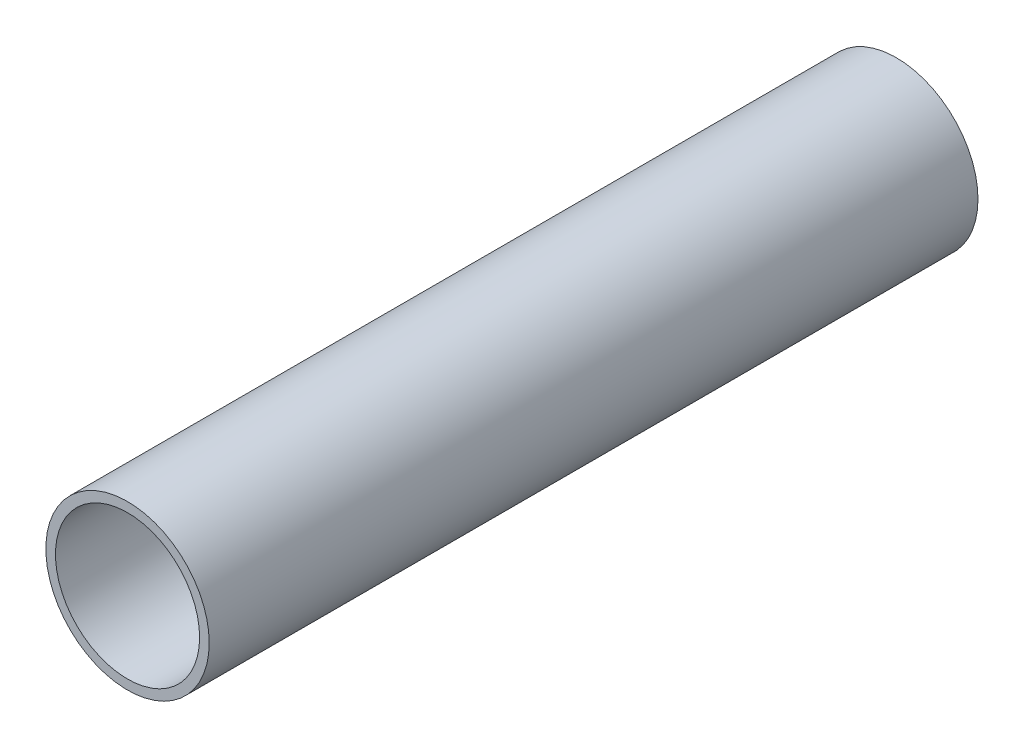
ISO-10303-21;
HEADER;
FILE_DESCRIPTION(('STEP AP214'),'2;1');
FILE_NAME('part.step','',(''),(''),'','','');
FILE_SCHEMA(('AUTOMOTIVE_DESIGN { 1 0 10303 214 1 1 1 1 }'));
ENDSEC;
DATA;
#1=APPLICATION_CONTEXT('core data for automotive mechanical design processes');
#2=APPLICATION_PROTOCOL_DEFINITION('international standard','automotive_design',2000,#1);
#3=PRODUCT_CONTEXT('',#1,'mechanical');
#4=PRODUCT('Part','Part','',(#3));
#5=PRODUCT_RELATED_PRODUCT_CATEGORY('part','',(#4));
#6=PRODUCT_DEFINITION_FORMATION('','',#4);
#7=PRODUCT_DEFINITION_CONTEXT('part definition',#1,'design');
#8=PRODUCT_DEFINITION('design','',#6,#7);
#9=PRODUCT_DEFINITION_SHAPE('','',#8);
#10=(LENGTH_UNIT() NAMED_UNIT(*) SI_UNIT(.MILLI.,.METRE.));
#11=(NAMED_UNIT(*) PLANE_ANGLE_UNIT() SI_UNIT($,.RADIAN.));
#12=(NAMED_UNIT(*) SI_UNIT($,.STERADIAN.) SOLID_ANGLE_UNIT());
#13=UNCERTAINTY_MEASURE_WITH_UNIT(LENGTH_MEASURE(1.E-05),#10,'distance_accuracy_value','');
#14=(GEOMETRIC_REPRESENTATION_CONTEXT(3) GLOBAL_UNCERTAINTY_ASSIGNED_CONTEXT((#13)) GLOBAL_UNIT_ASSIGNED_CONTEXT((#10,
#11,#12)) REPRESENTATION_CONTEXT('',''));
#15=CARTESIAN_POINT('',(0.,0.,0.));
#16=DIRECTION('',(0.,0.,1.));
#17=DIRECTION('',(1.,0.,0.));
#18=AXIS2_PLACEMENT_3D('',#15,#16,#17);
#19=CARTESIAN_POINT('',(0.,0.,80.));
#20=DIRECTION('',(0.,0.,-1.));
#21=DIRECTION('',(-1.,0.,0.));
#22=AXIS2_PLACEMENT_3D('',#19,#20,#21);
#23=CYLINDRICAL_SURFACE('',#22,15.);
#24=CARTESIAN_POINT('',(0.,0.,80.));
#25=DIRECTION('',(0.,0.,1.));
#26=DIRECTION('',(1.,0.,0.));
#27=AXIS2_PLACEMENT_3D('',#24,#25,#26);
#28=CIRCLE('',#27,15.);
#29=CARTESIAN_POINT('',(15.,0.,80.));
#30=VERTEX_POINT('',#29);
#31=EDGE_CURVE('E40',#30,#30,#28,.T.);
#32=ORIENTED_EDGE('',*,*,#31,.T.);
#33=EDGE_LOOP('',(#32));
#34=FACE_BOUND('',#33,.T.);
#35=CARTESIAN_POINT('',(0.,0.,-80.));
#36=DIRECTION('',(0.,0.,1.));
#37=DIRECTION('',(1.,0.,0.));
#38=AXIS2_PLACEMENT_3D('',#35,#36,#37);
#39=CIRCLE('',#38,15.);
#40=CARTESIAN_POINT('',(15.,0.,-80.));
#41=VERTEX_POINT('',#40);
#42=EDGE_CURVE('E46',#41,#41,#39,.T.);
#43=ORIENTED_EDGE('',*,*,#42,.F.);
#44=EDGE_LOOP('',(#43));
#45=FACE_BOUND('',#44,.T.);
#46=ADVANCED_FACE('F33',(#34,#45),#23,.F.);
#47=CARTESIAN_POINT('',(0.,0.,80.));
#48=DIRECTION('',(0.,0.,-1.));
#49=DIRECTION('',(-1.,0.,0.));
#50=AXIS2_PLACEMENT_3D('',#47,#48,#49);
#51=CYLINDRICAL_SURFACE('',#50,17.);
#52=CARTESIAN_POINT('',(0.,0.,80.));
#53=DIRECTION('',(0.,0.,1.));
#54=DIRECTION('',(1.,0.,0.));
#55=AXIS2_PLACEMENT_3D('',#52,#53,#54);
#56=CIRCLE('',#55,17.);
#57=CARTESIAN_POINT('',(17.,0.,80.));
#58=VERTEX_POINT('',#57);
#59=EDGE_CURVE('E10',#58,#58,#56,.T.);
#60=ORIENTED_EDGE('',*,*,#59,.F.);
#61=EDGE_LOOP('',(#60));
#62=FACE_BOUND('',#61,.T.);
#63=CARTESIAN_POINT('',(0.,0.,-80.));
#64=DIRECTION('',(0.,0.,1.));
#65=DIRECTION('',(1.,0.,0.));
#66=AXIS2_PLACEMENT_3D('',#63,#64,#65);
#67=CIRCLE('',#66,17.);
#68=CARTESIAN_POINT('',(17.,0.,-80.));
#69=VERTEX_POINT('',#68);
#70=EDGE_CURVE('E36',#69,#69,#67,.T.);
#71=ORIENTED_EDGE('',*,*,#70,.T.);
#72=EDGE_LOOP('',(#71));
#73=FACE_BOUND('',#72,.T.);
#74=ADVANCED_FACE('F53',(#62,#73),#51,.T.);
#75=CARTESIAN_POINT('',(0.,0.,80.));
#76=DIRECTION('',(0.,0.,1.));
#77=DIRECTION('',(1.,0.,0.));
#78=AXIS2_PLACEMENT_3D('',#75,#76,#77);
#79=PLANE('',#78);
#80=ORIENTED_EDGE('',*,*,#31,.F.);
#81=EDGE_LOOP('',(#80));
#82=FACE_BOUND('',#81,.T.);
#83=ORIENTED_EDGE('',*,*,#59,.T.);
#84=EDGE_LOOP('',(#83));
#85=FACE_BOUND('',#84,.T.);
#86=ADVANCED_FACE('F57',(#82,#85),#79,.T.);
#87=CARTESIAN_POINT('',(0.,0.,-80.));
#88=DIRECTION('',(0.,0.,1.));
#89=DIRECTION('',(1.,0.,0.));
#90=AXIS2_PLACEMENT_3D('',#87,#88,#89);
#91=PLANE('',#90);
#92=ORIENTED_EDGE('',*,*,#42,.T.);
#93=EDGE_LOOP('',(#92));
#94=FACE_BOUND('',#93,.T.);
#95=ORIENTED_EDGE('',*,*,#70,.F.);
#96=EDGE_LOOP('',(#95));
#97=FACE_BOUND('',#96,.T.);
#98=ADVANCED_FACE('F55',(#94,#97),#91,.F.);
#99=CLOSED_SHELL('',(#46,#74,#86,#98));
#100=MANIFOLD_SOLID_BREP('B2',#99);
#101=ADVANCED_BREP_SHAPE_REPRESENTATION('',(#18,#100),#14);
#102=SHAPE_DEFINITION_REPRESENTATION(#9,#101);
ENDSEC;
END-ISO-10303-21;
